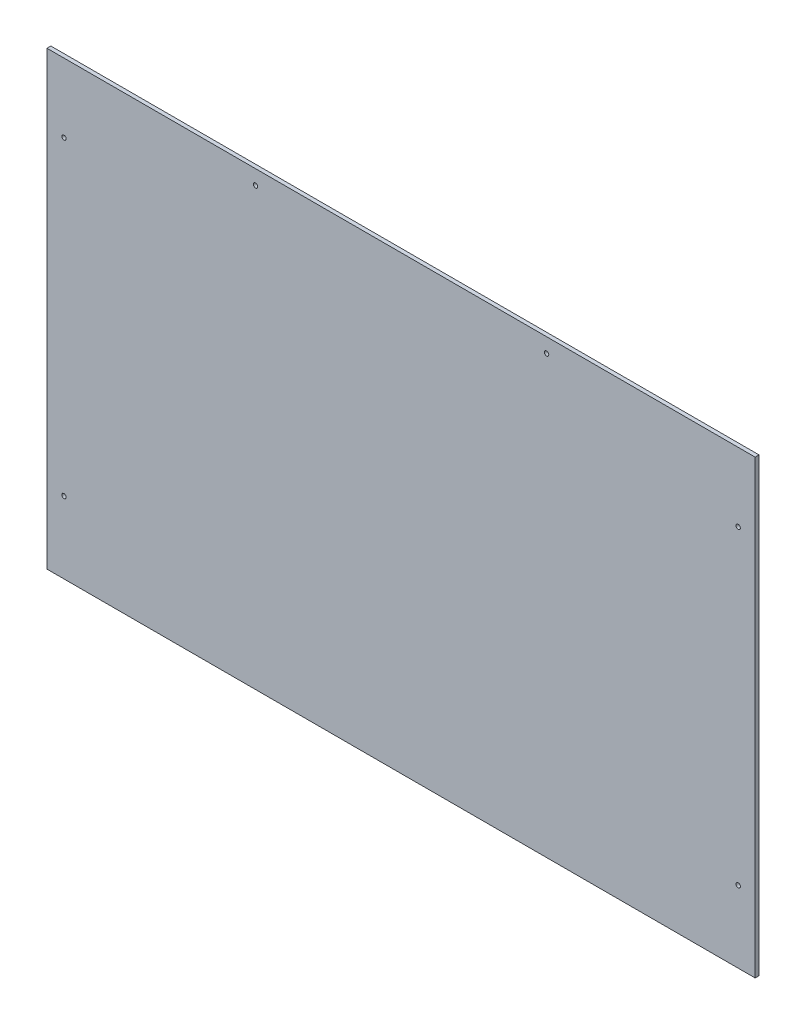
ISO-10303-21;
HEADER;
FILE_DESCRIPTION(('STEP AP214'),'2;1');
FILE_NAME('part.step','',(''),(''),'','','');
FILE_SCHEMA(('AUTOMOTIVE_DESIGN { 1 0 10303 214 1 1 1 1 }'));
ENDSEC;
DATA;
#1=APPLICATION_CONTEXT('core data for automotive mechanical design processes');
#2=APPLICATION_PROTOCOL_DEFINITION('international standard','automotive_design',2000,#1);
#3=PRODUCT_CONTEXT('',#1,'mechanical');
#4=PRODUCT('Part','Part','',(#3));
#5=PRODUCT_RELATED_PRODUCT_CATEGORY('part','',(#4));
#6=PRODUCT_DEFINITION_FORMATION('','',#4);
#7=PRODUCT_DEFINITION_CONTEXT('part definition',#1,'design');
#8=PRODUCT_DEFINITION('design','',#6,#7);
#9=PRODUCT_DEFINITION_SHAPE('','',#8);
#10=(LENGTH_UNIT() NAMED_UNIT(*) SI_UNIT(.MILLI.,.METRE.));
#11=(NAMED_UNIT(*) PLANE_ANGLE_UNIT() SI_UNIT($,.RADIAN.));
#12=(NAMED_UNIT(*) SI_UNIT($,.STERADIAN.) SOLID_ANGLE_UNIT());
#13=UNCERTAINTY_MEASURE_WITH_UNIT(LENGTH_MEASURE(1.E-05),#10,'distance_accuracy_value','');
#14=(GEOMETRIC_REPRESENTATION_CONTEXT(3) GLOBAL_UNCERTAINTY_ASSIGNED_CONTEXT((#13)) GLOBAL_UNIT_ASSIGNED_CONTEXT((#10,
#11,#12)) REPRESENTATION_CONTEXT('',''));
#15=CARTESIAN_POINT('',(0.,0.,0.));
#16=DIRECTION('',(0.,0.,1.));
#17=DIRECTION('',(1.,0.,0.));
#18=AXIS2_PLACEMENT_3D('',#15,#16,#17);
#19=CARTESIAN_POINT('',(-365.,0.,2.));
#20=DIRECTION('',(1.,0.,0.));
#21=DIRECTION('',(0.,1.,0.));
#22=AXIS2_PLACEMENT_3D('',#19,#20,#21);
#23=PLANE('',#22);
#24=DIRECTION('',(0.,-1.,0.));
#25=VECTOR('',#24,1.);
#26=CARTESIAN_POINT('',(-365.,0.,-2.));
#27=LINE('',#26,#25);
#28=CARTESIAN_POINT('',(-365.,0.,-2.));
#29=VERTEX_POINT('',#28);
#30=CARTESIAN_POINT('',(-365.,-465.,-2.));
#31=VERTEX_POINT('',#30);
#32=EDGE_CURVE('E99',#29,#31,#27,.T.);
#33=ORIENTED_EDGE('',*,*,#32,.T.);
#34=DIRECTION('',(0.,0.,-1.));
#35=VECTOR('',#34,1.);
#36=CARTESIAN_POINT('',(-365.,-465.,2.));
#37=LINE('',#36,#35);
#38=CARTESIAN_POINT('',(-365.,-465.,2.));
#39=VERTEX_POINT('',#38);
#40=EDGE_CURVE('E11',#39,#31,#37,.T.);
#41=ORIENTED_EDGE('',*,*,#40,.F.);
#42=DIRECTION('',(0.,-1.,0.));
#43=VECTOR('',#42,1.);
#44=CARTESIAN_POINT('',(-365.,0.,2.));
#45=LINE('',#44,#43);
#46=CARTESIAN_POINT('',(-365.,0.,2.));
#47=VERTEX_POINT('',#46);
#48=EDGE_CURVE('E87',#47,#39,#45,.T.);
#49=ORIENTED_EDGE('',*,*,#48,.F.);
#50=DIRECTION('',(0.,0.,-1.));
#51=VECTOR('',#50,1.);
#52=CARTESIAN_POINT('',(-365.,0.,2.));
#53=LINE('',#52,#51);
#54=EDGE_CURVE('E95',#47,#29,#53,.T.);
#55=ORIENTED_EDGE('',*,*,#54,.T.);
#56=EDGE_LOOP('',(#33,#41,#49,#55));
#57=FACE_BOUND('',#56,.T.);
#58=ADVANCED_FACE('F36',(#57),#23,.F.);
#59=CARTESIAN_POINT('',(-365.,-465.,2.));
#60=DIRECTION('',(0.,1.,0.));
#61=DIRECTION('',(0.,0.,1.));
#62=AXIS2_PLACEMENT_3D('',#59,#60,#61);
#63=PLANE('',#62);
#64=DIRECTION('',(1.,0.,0.));
#65=VECTOR('',#64,1.);
#66=CARTESIAN_POINT('',(-365.,-465.,-2.));
#67=LINE('',#66,#65);
#68=CARTESIAN_POINT('',(365.,-465.,-2.));
#69=VERTEX_POINT('',#68);
#70=EDGE_CURVE('E91',#31,#69,#67,.T.);
#71=ORIENTED_EDGE('',*,*,#70,.T.);
#72=DIRECTION('',(0.,0.,-1.));
#73=VECTOR('',#72,1.);
#74=CARTESIAN_POINT('',(365.,-465.,2.));
#75=LINE('',#74,#73);
#76=CARTESIAN_POINT('',(365.,-465.,2.));
#77=VERTEX_POINT('',#76);
#78=EDGE_CURVE('E44',#77,#69,#75,.T.);
#79=ORIENTED_EDGE('',*,*,#78,.F.);
#80=DIRECTION('',(1.,0.,0.));
#81=VECTOR('',#80,1.);
#82=CARTESIAN_POINT('',(-365.,-465.,2.));
#83=LINE('',#82,#81);
#84=EDGE_CURVE('E82',#39,#77,#83,.T.);
#85=ORIENTED_EDGE('',*,*,#84,.F.);
#86=ORIENTED_EDGE('',*,*,#40,.T.);
#87=EDGE_LOOP('',(#71,#79,#85,#86));
#88=FACE_BOUND('',#87,.T.);
#89=ADVANCED_FACE('F90',(#88),#63,.F.);
#90=CARTESIAN_POINT('',(365.,0.,2.));
#91=DIRECTION('',(-1.,0.,0.));
#92=DIRECTION('',(0.,-1.,0.));
#93=AXIS2_PLACEMENT_3D('',#90,#91,#92);
#94=PLANE('',#93);
#95=DIRECTION('',(0.,1.,0.));
#96=VECTOR('',#95,1.);
#97=CARTESIAN_POINT('',(365.,0.,-2.));
#98=LINE('',#97,#96);
#99=CARTESIAN_POINT('',(365.,0.,-2.));
#100=VERTEX_POINT('',#99);
#101=EDGE_CURVE('E69',#69,#100,#98,.T.);
#102=ORIENTED_EDGE('',*,*,#101,.T.);
#103=DIRECTION('',(0.,0.,-1.));
#104=VECTOR('',#103,1.);
#105=CARTESIAN_POINT('',(365.,0.,2.));
#106=LINE('',#105,#104);
#107=CARTESIAN_POINT('',(365.,0.,2.));
#108=VERTEX_POINT('',#107);
#109=EDGE_CURVE('E92',#108,#100,#106,.T.);
#110=ORIENTED_EDGE('',*,*,#109,.F.);
#111=DIRECTION('',(0.,1.,0.));
#112=VECTOR('',#111,1.);
#113=CARTESIAN_POINT('',(365.,0.,2.));
#114=LINE('',#113,#112);
#115=EDGE_CURVE('E85',#77,#108,#114,.T.);
#116=ORIENTED_EDGE('',*,*,#115,.F.);
#117=ORIENTED_EDGE('',*,*,#78,.T.);
#118=EDGE_LOOP('',(#102,#110,#116,#117));
#119=FACE_BOUND('',#118,.T.);
#120=ADVANCED_FACE('F93',(#119),#94,.F.);
#121=CARTESIAN_POINT('',(-365.,0.,2.));
#122=DIRECTION('',(0.,-1.,0.));
#123=DIRECTION('',(0.,0.,-1.));
#124=AXIS2_PLACEMENT_3D('',#121,#122,#123);
#125=PLANE('',#124);
#126=DIRECTION('',(-1.,0.,0.));
#127=VECTOR('',#126,1.);
#128=CARTESIAN_POINT('',(-365.,0.,-2.));
#129=LINE('',#128,#127);
#130=EDGE_CURVE('E75',#100,#29,#129,.T.);
#131=ORIENTED_EDGE('',*,*,#130,.T.);
#132=ORIENTED_EDGE('',*,*,#54,.F.);
#133=DIRECTION('',(-1.,0.,0.));
#134=VECTOR('',#133,1.);
#135=CARTESIAN_POINT('',(-365.,0.,2.));
#136=LINE('',#135,#134);
#137=EDGE_CURVE('E52',#108,#47,#136,.T.);
#138=ORIENTED_EDGE('',*,*,#137,.F.);
#139=ORIENTED_EDGE('',*,*,#109,.T.);
#140=EDGE_LOOP('',(#131,#132,#138,#139));
#141=FACE_BOUND('',#140,.T.);
#142=ADVANCED_FACE('F107',(#141),#125,.F.);
#143=CARTESIAN_POINT('',(0.,0.,2.));
#144=DIRECTION('',(0.,0.,1.));
#145=DIRECTION('',(1.,0.,0.));
#146=AXIS2_PLACEMENT_3D('',#143,#144,#145);
#147=PLANE('',#146);
#148=CARTESIAN_POINT('',(347.5,-71.,2.));
#149=DIRECTION('',(0.,0.,1.));
#150=DIRECTION('',(-1.,0.,0.));
#151=AXIS2_PLACEMENT_3D('',#148,#149,#150);
#152=CIRCLE('',#151,2.24999999999995);
#153=CARTESIAN_POINT('',(345.25,-71.,2.));
#154=VERTEX_POINT('',#153);
#155=EDGE_CURVE('E143',#154,#154,#152,.T.);
#156=ORIENTED_EDGE('',*,*,#155,.F.);
#157=EDGE_LOOP('',(#156));
#158=FACE_BOUND('',#157,.T.);
#159=CARTESIAN_POINT('',(347.5,-391.,2.));
#160=DIRECTION('',(0.,0.,1.));
#161=DIRECTION('',(-1.,0.,0.));
#162=AXIS2_PLACEMENT_3D('',#159,#160,#161);
#163=CIRCLE('',#162,2.24999999999996);
#164=CARTESIAN_POINT('',(345.25,-391.,2.));
#165=VERTEX_POINT('',#164);
#166=EDGE_CURVE('E137',#165,#165,#163,.T.);
#167=ORIENTED_EDGE('',*,*,#166,.F.);
#168=EDGE_LOOP('',(#167));
#169=FACE_BOUND('',#168,.T.);
#170=CARTESIAN_POINT('',(-347.5,-391.,2.));
#171=DIRECTION('',(0.,0.,1.));
#172=DIRECTION('',(1.,0.,0.));
#173=AXIS2_PLACEMENT_3D('',#170,#171,#172);
#174=CIRCLE('',#173,2.24999999999996);
#175=CARTESIAN_POINT('',(-345.25,-391.,2.));
#176=VERTEX_POINT('',#175);
#177=EDGE_CURVE('E131',#176,#176,#174,.T.);
#178=ORIENTED_EDGE('',*,*,#177,.F.);
#179=EDGE_LOOP('',(#178));
#180=FACE_BOUND('',#179,.T.);
#181=CARTESIAN_POINT('',(-347.5,-71.0000000000001,2.));
#182=DIRECTION('',(0.,0.,1.));
#183=DIRECTION('',(1.,0.,0.));
#184=AXIS2_PLACEMENT_3D('',#181,#182,#183);
#185=CIRCLE('',#184,2.24999999999995);
#186=CARTESIAN_POINT('',(-345.25,-71.0000000000001,2.));
#187=VERTEX_POINT('',#186);
#188=EDGE_CURVE('E125',#187,#187,#185,.T.);
#189=ORIENTED_EDGE('',*,*,#188,.F.);
#190=EDGE_LOOP('',(#189));
#191=FACE_BOUND('',#190,.T.);
#192=CARTESIAN_POINT('',(150.,-15.0000000000001,2.));
#193=DIRECTION('',(0.,0.,1.));
#194=DIRECTION('',(1.,0.,0.));
#195=AXIS2_PLACEMENT_3D('',#192,#193,#194);
#196=CIRCLE('',#195,2.25000000000001);
#197=CARTESIAN_POINT('',(152.25,-15.0000000000001,2.));
#198=VERTEX_POINT('',#197);
#199=EDGE_CURVE('E119',#198,#198,#196,.T.);
#200=ORIENTED_EDGE('',*,*,#199,.F.);
#201=EDGE_LOOP('',(#200));
#202=FACE_BOUND('',#201,.T.);
#203=CARTESIAN_POINT('',(-150.,-15.0000000000001,2.));
#204=DIRECTION('',(0.,0.,1.));
#205=DIRECTION('',(1.,0.,0.));
#206=AXIS2_PLACEMENT_3D('',#203,#204,#205);
#207=CIRCLE('',#206,2.25000000000001);
#208=CARTESIAN_POINT('',(-147.75,-15.0000000000001,2.));
#209=VERTEX_POINT('',#208);
#210=EDGE_CURVE('E113',#209,#209,#207,.T.);
#211=ORIENTED_EDGE('',*,*,#210,.F.);
#212=EDGE_LOOP('',(#211));
#213=FACE_BOUND('',#212,.T.);
#214=ORIENTED_EDGE('',*,*,#48,.T.);
#215=ORIENTED_EDGE('',*,*,#84,.T.);
#216=ORIENTED_EDGE('',*,*,#115,.T.);
#217=ORIENTED_EDGE('',*,*,#137,.T.);
#218=EDGE_LOOP('',(#214,#215,#216,#217));
#219=FACE_BOUND('',#218,.T.);
#220=ADVANCED_FACE('F83',(#158,#169,#180,#191,#202,#213,#219),#147,.T.);
#221=CARTESIAN_POINT('',(0.,0.,-2.));
#222=DIRECTION('',(0.,0.,1.));
#223=DIRECTION('',(1.,0.,0.));
#224=AXIS2_PLACEMENT_3D('',#221,#222,#223);
#225=PLANE('',#224);
#226=CARTESIAN_POINT('',(347.5,-71.,-2.));
#227=DIRECTION('',(0.,0.,1.));
#228=DIRECTION('',(-1.,0.,0.));
#229=AXIS2_PLACEMENT_3D('',#226,#227,#228);
#230=CIRCLE('',#229,2.24999999999995);
#231=CARTESIAN_POINT('',(345.25,-71.,-2.));
#232=VERTEX_POINT('',#231);
#233=EDGE_CURVE('E140',#232,#232,#230,.T.);
#234=ORIENTED_EDGE('',*,*,#233,.T.);
#235=EDGE_LOOP('',(#234));
#236=FACE_BOUND('',#235,.T.);
#237=CARTESIAN_POINT('',(347.5,-391.,-2.));
#238=DIRECTION('',(0.,0.,1.));
#239=DIRECTION('',(-1.,0.,0.));
#240=AXIS2_PLACEMENT_3D('',#237,#238,#239);
#241=CIRCLE('',#240,2.24999999999996);
#242=CARTESIAN_POINT('',(345.25,-391.,-2.));
#243=VERTEX_POINT('',#242);
#244=EDGE_CURVE('E134',#243,#243,#241,.T.);
#245=ORIENTED_EDGE('',*,*,#244,.T.);
#246=EDGE_LOOP('',(#245));
#247=FACE_BOUND('',#246,.T.);
#248=CARTESIAN_POINT('',(-347.5,-391.,-2.));
#249=DIRECTION('',(0.,0.,1.));
#250=DIRECTION('',(1.,0.,0.));
#251=AXIS2_PLACEMENT_3D('',#248,#249,#250);
#252=CIRCLE('',#251,2.24999999999996);
#253=CARTESIAN_POINT('',(-345.25,-391.,-2.));
#254=VERTEX_POINT('',#253);
#255=EDGE_CURVE('E128',#254,#254,#252,.T.);
#256=ORIENTED_EDGE('',*,*,#255,.T.);
#257=EDGE_LOOP('',(#256));
#258=FACE_BOUND('',#257,.T.);
#259=CARTESIAN_POINT('',(-347.5,-71.0000000000001,-2.));
#260=DIRECTION('',(0.,0.,1.));
#261=DIRECTION('',(1.,0.,0.));
#262=AXIS2_PLACEMENT_3D('',#259,#260,#261);
#263=CIRCLE('',#262,2.24999999999995);
#264=CARTESIAN_POINT('',(-345.25,-71.0000000000001,-2.));
#265=VERTEX_POINT('',#264);
#266=EDGE_CURVE('E122',#265,#265,#263,.T.);
#267=ORIENTED_EDGE('',*,*,#266,.T.);
#268=EDGE_LOOP('',(#267));
#269=FACE_BOUND('',#268,.T.);
#270=CARTESIAN_POINT('',(150.,-15.0000000000001,-2.));
#271=DIRECTION('',(0.,0.,1.));
#272=DIRECTION('',(1.,0.,0.));
#273=AXIS2_PLACEMENT_3D('',#270,#271,#272);
#274=CIRCLE('',#273,2.25000000000001);
#275=CARTESIAN_POINT('',(152.25,-15.0000000000001,-2.));
#276=VERTEX_POINT('',#275);
#277=EDGE_CURVE('E116',#276,#276,#274,.T.);
#278=ORIENTED_EDGE('',*,*,#277,.T.);
#279=EDGE_LOOP('',(#278));
#280=FACE_BOUND('',#279,.T.);
#281=CARTESIAN_POINT('',(-150.,-15.0000000000001,-2.));
#282=DIRECTION('',(0.,0.,1.));
#283=DIRECTION('',(1.,0.,0.));
#284=AXIS2_PLACEMENT_3D('',#281,#282,#283);
#285=CIRCLE('',#284,2.25000000000001);
#286=CARTESIAN_POINT('',(-147.75,-15.0000000000001,-2.));
#287=VERTEX_POINT('',#286);
#288=EDGE_CURVE('E102',#287,#287,#285,.T.);
#289=ORIENTED_EDGE('',*,*,#288,.T.);
#290=EDGE_LOOP('',(#289));
#291=FACE_BOUND('',#290,.T.);
#292=ORIENTED_EDGE('',*,*,#32,.F.);
#293=ORIENTED_EDGE('',*,*,#130,.F.);
#294=ORIENTED_EDGE('',*,*,#101,.F.);
#295=ORIENTED_EDGE('',*,*,#70,.F.);
#296=EDGE_LOOP('',(#292,#293,#294,#295));
#297=FACE_BOUND('',#296,.T.);
#298=ADVANCED_FACE('F110',(#236,#247,#258,#269,#280,#291,#297),#225,.F.);
#299=CARTESIAN_POINT('',(-150.,-15.0000000000001,-2.));
#300=DIRECTION('',(0.,0.,1.));
#301=DIRECTION('',(1.,0.,0.));
#302=AXIS2_PLACEMENT_3D('',#299,#300,#301);
#303=CYLINDRICAL_SURFACE('',#302,2.25000000000001);
#304=ORIENTED_EDGE('',*,*,#288,.F.);
#305=EDGE_LOOP('',(#304));
#306=FACE_BOUND('',#305,.T.);
#307=ORIENTED_EDGE('',*,*,#210,.T.);
#308=EDGE_LOOP('',(#307));
#309=FACE_BOUND('',#308,.T.);
#310=ADVANCED_FACE('F171',(#306,#309),#303,.F.);
#311=CARTESIAN_POINT('',(150.,-15.0000000000001,-2.));
#312=DIRECTION('',(0.,0.,1.));
#313=DIRECTION('',(1.,0.,0.));
#314=AXIS2_PLACEMENT_3D('',#311,#312,#313);
#315=CYLINDRICAL_SURFACE('',#314,2.25000000000001);
#316=ORIENTED_EDGE('',*,*,#277,.F.);
#317=EDGE_LOOP('',(#316));
#318=FACE_BOUND('',#317,.T.);
#319=ORIENTED_EDGE('',*,*,#199,.T.);
#320=EDGE_LOOP('',(#319));
#321=FACE_BOUND('',#320,.T.);
#322=ADVANCED_FACE('F173',(#318,#321),#315,.F.);
#323=CARTESIAN_POINT('',(-347.5,-71.0000000000001,-2.));
#324=DIRECTION('',(0.,0.,1.));
#325=DIRECTION('',(1.,0.,0.));
#326=AXIS2_PLACEMENT_3D('',#323,#324,#325);
#327=CYLINDRICAL_SURFACE('',#326,2.24999999999995);
#328=ORIENTED_EDGE('',*,*,#266,.F.);
#329=EDGE_LOOP('',(#328));
#330=FACE_BOUND('',#329,.T.);
#331=ORIENTED_EDGE('',*,*,#188,.T.);
#332=EDGE_LOOP('',(#331));
#333=FACE_BOUND('',#332,.T.);
#334=ADVANCED_FACE('F180',(#330,#333),#327,.F.);
#335=CARTESIAN_POINT('',(-347.5,-391.,-2.));
#336=DIRECTION('',(0.,0.,1.));
#337=DIRECTION('',(1.,0.,0.));
#338=AXIS2_PLACEMENT_3D('',#335,#336,#337);
#339=CYLINDRICAL_SURFACE('',#338,2.24999999999996);
#340=ORIENTED_EDGE('',*,*,#255,.F.);
#341=EDGE_LOOP('',(#340));
#342=FACE_BOUND('',#341,.T.);
#343=ORIENTED_EDGE('',*,*,#177,.T.);
#344=EDGE_LOOP('',(#343));
#345=FACE_BOUND('',#344,.T.);
#346=ADVANCED_FACE('F226',(#342,#345),#339,.F.);
#347=CARTESIAN_POINT('',(347.5,-391.,-2.));
#348=DIRECTION('',(0.,0.,1.));
#349=DIRECTION('',(1.,0.,0.));
#350=AXIS2_PLACEMENT_3D('',#347,#348,#349);
#351=CYLINDRICAL_SURFACE('',#350,2.24999999999996);
#352=ORIENTED_EDGE('',*,*,#244,.F.);
#353=EDGE_LOOP('',(#352));
#354=FACE_BOUND('',#353,.T.);
#355=ORIENTED_EDGE('',*,*,#166,.T.);
#356=EDGE_LOOP('',(#355));
#357=FACE_BOUND('',#356,.T.);
#358=ADVANCED_FACE('F154',(#354,#357),#351,.F.);
#359=CARTESIAN_POINT('',(347.5,-71.,-2.));
#360=DIRECTION('',(0.,0.,1.));
#361=DIRECTION('',(1.,0.,0.));
#362=AXIS2_PLACEMENT_3D('',#359,#360,#361);
#363=CYLINDRICAL_SURFACE('',#362,2.24999999999995);
#364=ORIENTED_EDGE('',*,*,#233,.F.);
#365=EDGE_LOOP('',(#364));
#366=FACE_BOUND('',#365,.T.);
#367=ORIENTED_EDGE('',*,*,#155,.T.);
#368=EDGE_LOOP('',(#367));
#369=FACE_BOUND('',#368,.T.);
#370=ADVANCED_FACE('F151',(#366,#369),#363,.F.);
#371=CLOSED_SHELL('',(#58,#89,#120,#142,#220,#298,#310,#322,#334,#346,#358,#370));
#372=MANIFOLD_SOLID_BREP('B2',#371);
#373=ADVANCED_BREP_SHAPE_REPRESENTATION('',(#18,#372),#14);
#374=SHAPE_DEFINITION_REPRESENTATION(#9,#373);
ENDSEC;
END-ISO-10303-21;
